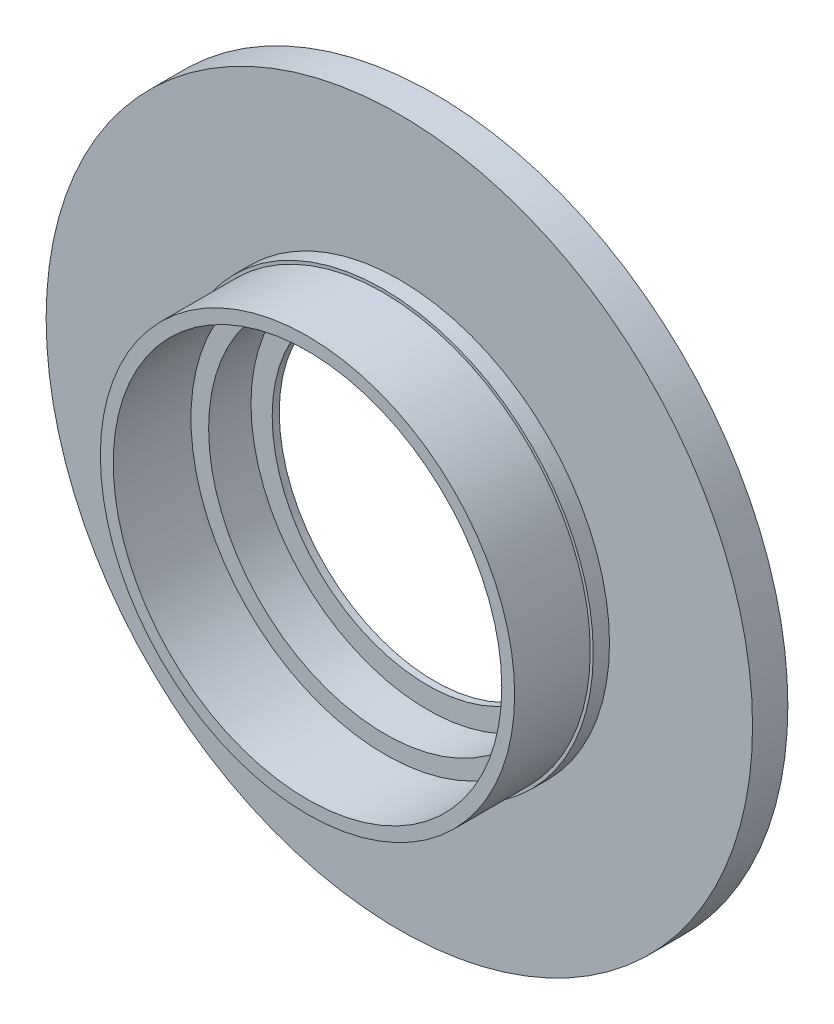
ISO-10303-21;
HEADER;
FILE_DESCRIPTION(('STEP AP214'),'2;1');
FILE_NAME('part.step','',(''),(''),'','','');
FILE_SCHEMA(('AUTOMOTIVE_DESIGN { 1 0 10303 214 1 1 1 1 }'));
ENDSEC;
DATA;
#1=APPLICATION_CONTEXT('core data for automotive mechanical design processes');
#2=APPLICATION_PROTOCOL_DEFINITION('international standard','automotive_design',2000,#1);
#3=PRODUCT_CONTEXT('',#1,'mechanical');
#4=PRODUCT('Part','Part','',(#3));
#5=PRODUCT_RELATED_PRODUCT_CATEGORY('part','',(#4));
#6=PRODUCT_DEFINITION_FORMATION('','',#4);
#7=PRODUCT_DEFINITION_CONTEXT('part definition',#1,'design');
#8=PRODUCT_DEFINITION('design','',#6,#7);
#9=PRODUCT_DEFINITION_SHAPE('','',#8);
#10=(LENGTH_UNIT() NAMED_UNIT(*) SI_UNIT(.MILLI.,.METRE.));
#11=(NAMED_UNIT(*) PLANE_ANGLE_UNIT() SI_UNIT($,.RADIAN.));
#12=(NAMED_UNIT(*) SI_UNIT($,.STERADIAN.) SOLID_ANGLE_UNIT());
#13=UNCERTAINTY_MEASURE_WITH_UNIT(LENGTH_MEASURE(1.E-05),#10,'distance_accuracy_value','');
#14=(GEOMETRIC_REPRESENTATION_CONTEXT(3) GLOBAL_UNCERTAINTY_ASSIGNED_CONTEXT((#13)) GLOBAL_UNIT_ASSIGNED_CONTEXT((#10,
#11,#12)) REPRESENTATION_CONTEXT('',''));
#15=CARTESIAN_POINT('',(0.,0.,0.));
#16=DIRECTION('',(0.,0.,1.));
#17=DIRECTION('',(1.,0.,0.));
#18=AXIS2_PLACEMENT_3D('',#15,#16,#17);
#19=CARTESIAN_POINT('',(0.,0.,5.));
#20=DIRECTION('',(0.,0.,-1.));
#21=DIRECTION('',(-1.,0.,0.));
#22=AXIS2_PLACEMENT_3D('',#19,#20,#21);
#23=CYLINDRICAL_SURFACE('',#22,22.);
#24=CARTESIAN_POINT('',(0.,0.,0.));
#25=DIRECTION('',(0.,0.,1.));
#26=DIRECTION('',(1.,0.,0.));
#27=AXIS2_PLACEMENT_3D('',#24,#25,#26);
#28=CIRCLE('',#27,22.);
#29=CARTESIAN_POINT('',(22.,0.,0.));
#30=VERTEX_POINT('',#29);
#31=EDGE_CURVE('E54',#30,#30,#28,.T.);
#32=ORIENTED_EDGE('',*,*,#31,.F.);
#33=EDGE_LOOP('',(#32));
#34=FACE_BOUND('',#33,.T.);
#35=CARTESIAN_POINT('',(0.,0.,1.));
#36=DIRECTION('',(0.,0.,1.));
#37=DIRECTION('',(1.,0.,0.));
#38=AXIS2_PLACEMENT_3D('',#35,#36,#37);
#39=CIRCLE('',#38,22.);
#40=CARTESIAN_POINT('',(22.,0.,1.));
#41=VERTEX_POINT('',#40);
#42=EDGE_CURVE('E97',#41,#41,#39,.T.);
#43=ORIENTED_EDGE('',*,*,#42,.T.);
#44=EDGE_LOOP('',(#43));
#45=FACE_BOUND('',#44,.T.);
#46=ADVANCED_FACE('F39',(#34,#45),#23,.F.);
#47=CARTESIAN_POINT('',(0.,0.,5.));
#48=DIRECTION('',(0.,0.,1.));
#49=DIRECTION('',(1.,0.,0.));
#50=AXIS2_PLACEMENT_3D('',#47,#48,#49);
#51=PLANE('',#50);
#52=CARTESIAN_POINT('',(0.,0.,5.));
#53=DIRECTION('',(0.,0.,1.));
#54=DIRECTION('',(1.,0.,0.));
#55=AXIS2_PLACEMENT_3D('',#52,#53,#54);
#56=CIRCLE('',#55,50.);
#57=CARTESIAN_POINT('',(50.,0.,5.));
#58=VERTEX_POINT('',#57);
#59=EDGE_CURVE('E47',#58,#58,#56,.T.);
#60=ORIENTED_EDGE('',*,*,#59,.T.);
#61=EDGE_LOOP('',(#60));
#62=FACE_BOUND('',#61,.T.);
#63=CARTESIAN_POINT('',(0.,0.,5.));
#64=DIRECTION('',(0.,0.,1.));
#65=DIRECTION('',(1.,0.,0.));
#66=AXIS2_PLACEMENT_3D('',#63,#64,#65);
#67=CIRCLE('',#66,29.75);
#68=CARTESIAN_POINT('',(29.75,0.,5.));
#69=VERTEX_POINT('',#68);
#70=EDGE_CURVE('E83',#69,#69,#67,.T.);
#71=ORIENTED_EDGE('',*,*,#70,.F.);
#72=EDGE_LOOP('',(#71));
#73=FACE_BOUND('',#72,.T.);
#74=ADVANCED_FACE('F120',(#62,#73),#51,.T.);
#75=CARTESIAN_POINT('',(0.,0.,5.));
#76=DIRECTION('',(0.,0.,-1.));
#77=DIRECTION('',(-1.,0.,0.));
#78=AXIS2_PLACEMENT_3D('',#75,#76,#77);
#79=CYLINDRICAL_SURFACE('',#78,50.);
#80=ORIENTED_EDGE('',*,*,#59,.F.);
#81=EDGE_LOOP('',(#80));
#82=FACE_BOUND('',#81,.T.);
#83=CARTESIAN_POINT('',(0.,0.,0.));
#84=DIRECTION('',(0.,0.,1.));
#85=DIRECTION('',(1.,0.,0.));
#86=AXIS2_PLACEMENT_3D('',#83,#84,#85);
#87=CIRCLE('',#86,50.);
#88=CARTESIAN_POINT('',(50.,0.,0.));
#89=VERTEX_POINT('',#88);
#90=EDGE_CURVE('E61',#89,#89,#87,.T.);
#91=ORIENTED_EDGE('',*,*,#90,.T.);
#92=EDGE_LOOP('',(#91));
#93=FACE_BOUND('',#92,.T.);
#94=ADVANCED_FACE('F41',(#82,#93),#79,.T.);
#95=CARTESIAN_POINT('',(0.,0.,0.));
#96=DIRECTION('',(0.,0.,1.));
#97=DIRECTION('',(1.,0.,0.));
#98=AXIS2_PLACEMENT_3D('',#95,#96,#97);
#99=PLANE('',#98);
#100=ORIENTED_EDGE('',*,*,#90,.F.);
#101=EDGE_LOOP('',(#100));
#102=FACE_BOUND('',#101,.T.);
#103=ORIENTED_EDGE('',*,*,#31,.T.);
#104=EDGE_LOOP('',(#103));
#105=FACE_BOUND('',#104,.T.);
#106=ADVANCED_FACE('F128',(#102,#105),#99,.F.);
#107=CARTESIAN_POINT('',(0.,0.,18.));
#108=DIRECTION('',(0.,0.,-1.));
#109=DIRECTION('',(-1.,0.,0.));
#110=AXIS2_PLACEMENT_3D('',#107,#108,#109);
#111=CYLINDRICAL_SURFACE('',#110,27.5);
#112=CARTESIAN_POINT('',(0.,0.,7.));
#113=DIRECTION('',(0.,0.,1.));
#114=DIRECTION('',(1.,0.,0.));
#115=AXIS2_PLACEMENT_3D('',#112,#113,#114);
#116=CIRCLE('',#115,27.5);
#117=CARTESIAN_POINT('',(27.5,0.,7.));
#118=VERTEX_POINT('',#117);
#119=EDGE_CURVE('E10',#118,#118,#116,.T.);
#120=ORIENTED_EDGE('',*,*,#119,.F.);
#121=EDGE_LOOP('',(#120));
#122=FACE_BOUND('',#121,.T.);
#123=CARTESIAN_POINT('',(0.,0.,18.));
#124=DIRECTION('',(0.,0.,1.));
#125=DIRECTION('',(1.,0.,0.));
#126=AXIS2_PLACEMENT_3D('',#123,#124,#125);
#127=CIRCLE('',#126,27.5);
#128=CARTESIAN_POINT('',(27.5,0.,18.));
#129=VERTEX_POINT('',#128);
#130=EDGE_CURVE('E73',#129,#129,#127,.T.);
#131=ORIENTED_EDGE('',*,*,#130,.T.);
#132=EDGE_LOOP('',(#131));
#133=FACE_BOUND('',#132,.T.);
#134=ADVANCED_FACE('F130',(#122,#133),#111,.F.);
#135=CARTESIAN_POINT('',(0.,0.,18.));
#136=DIRECTION('',(0.,0.,-1.));
#137=DIRECTION('',(-1.,0.,0.));
#138=AXIS2_PLACEMENT_3D('',#135,#136,#137);
#139=CYLINDRICAL_SURFACE('',#138,29.325);
#140=CARTESIAN_POINT('',(0.,0.,7.3));
#141=DIRECTION('',(0.,0.,1.));
#142=DIRECTION('',(1.,0.,0.));
#143=AXIS2_PLACEMENT_3D('',#140,#141,#142);
#144=CIRCLE('',#143,29.325);
#145=CARTESIAN_POINT('',(29.325,0.,7.3));
#146=VERTEX_POINT('',#145);
#147=EDGE_CURVE('E87',#146,#146,#144,.T.);
#148=ORIENTED_EDGE('',*,*,#147,.T.);
#149=EDGE_LOOP('',(#148));
#150=FACE_BOUND('',#149,.T.);
#151=CARTESIAN_POINT('',(0.,0.,18.));
#152=DIRECTION('',(0.,0.,1.));
#153=DIRECTION('',(1.,0.,0.));
#154=AXIS2_PLACEMENT_3D('',#151,#152,#153);
#155=CIRCLE('',#154,29.325);
#156=CARTESIAN_POINT('',(29.325,0.,18.));
#157=VERTEX_POINT('',#156);
#158=EDGE_CURVE('E64',#157,#157,#155,.T.);
#159=ORIENTED_EDGE('',*,*,#158,.F.);
#160=EDGE_LOOP('',(#159));
#161=FACE_BOUND('',#160,.T.);
#162=ADVANCED_FACE('F135',(#150,#161),#139,.T.);
#163=CARTESIAN_POINT('',(0.,0.,18.));
#164=DIRECTION('',(0.,0.,1.));
#165=DIRECTION('',(1.,0.,0.));
#166=AXIS2_PLACEMENT_3D('',#163,#164,#165);
#167=PLANE('',#166);
#168=ORIENTED_EDGE('',*,*,#130,.F.);
#169=EDGE_LOOP('',(#168));
#170=FACE_BOUND('',#169,.T.);
#171=ORIENTED_EDGE('',*,*,#158,.T.);
#172=EDGE_LOOP('',(#171));
#173=FACE_BOUND('',#172,.T.);
#174=ADVANCED_FACE('F139',(#170,#173),#167,.T.);
#175=CARTESIAN_POINT('',(0.,0.,7.3));
#176=DIRECTION('',(0.,0.,1.));
#177=DIRECTION('',(1.,0.,0.));
#178=AXIS2_PLACEMENT_3D('',#175,#176,#177);
#179=PLANE('',#178);
#180=CARTESIAN_POINT('',(0.,0.,7.3));
#181=DIRECTION('',(0.,0.,1.));
#182=DIRECTION('',(1.,0.,0.));
#183=AXIS2_PLACEMENT_3D('',#180,#181,#182);
#184=CIRCLE('',#183,29.75);
#185=CARTESIAN_POINT('',(29.75,0.,7.3));
#186=VERTEX_POINT('',#185);
#187=EDGE_CURVE('E79',#186,#186,#184,.T.);
#188=ORIENTED_EDGE('',*,*,#187,.T.);
#189=EDGE_LOOP('',(#188));
#190=FACE_BOUND('',#189,.T.);
#191=ORIENTED_EDGE('',*,*,#147,.F.);
#192=EDGE_LOOP('',(#191));
#193=FACE_BOUND('',#192,.T.);
#194=ADVANCED_FACE('F143',(#190,#193),#179,.T.);
#195=CARTESIAN_POINT('',(0.,0.,7.3));
#196=DIRECTION('',(0.,0.,-1.));
#197=DIRECTION('',(-1.,0.,0.));
#198=AXIS2_PLACEMENT_3D('',#195,#196,#197);
#199=CYLINDRICAL_SURFACE('',#198,29.75);
#200=ORIENTED_EDGE('',*,*,#187,.F.);
#201=EDGE_LOOP('',(#200));
#202=FACE_BOUND('',#201,.T.);
#203=ORIENTED_EDGE('',*,*,#70,.T.);
#204=EDGE_LOOP('',(#203));
#205=FACE_BOUND('',#204,.T.);
#206=ADVANCED_FACE('F117',(#202,#205),#199,.T.);
#207=CARTESIAN_POINT('',(0.,0.,7.));
#208=DIRECTION('',(0.,0.,1.));
#209=DIRECTION('',(1.,0.,0.));
#210=AXIS2_PLACEMENT_3D('',#207,#208,#209);
#211=PLANE('',#210);
#212=ORIENTED_EDGE('',*,*,#119,.T.);
#213=EDGE_LOOP('',(#212));
#214=FACE_BOUND('',#213,.T.);
#215=CARTESIAN_POINT('',(0.,0.,7.));
#216=DIRECTION('',(0.,0.,1.));
#217=DIRECTION('',(1.,0.,0.));
#218=AXIS2_PLACEMENT_3D('',#215,#216,#217);
#219=CIRCLE('',#218,25.);
#220=CARTESIAN_POINT('',(25.,0.,7.));
#221=VERTEX_POINT('',#220);
#222=EDGE_CURVE('E91',#221,#221,#219,.T.);
#223=ORIENTED_EDGE('',*,*,#222,.F.);
#224=EDGE_LOOP('',(#223));
#225=FACE_BOUND('',#224,.T.);
#226=ADVANCED_FACE('F111',(#214,#225),#211,.T.);
#227=CARTESIAN_POINT('',(0.,0.,7.));
#228=DIRECTION('',(0.,0.,-1.));
#229=DIRECTION('',(-1.,0.,0.));
#230=AXIS2_PLACEMENT_3D('',#227,#228,#229);
#231=CYLINDRICAL_SURFACE('',#230,25.);
#232=ORIENTED_EDGE('',*,*,#222,.T.);
#233=EDGE_LOOP('',(#232));
#234=FACE_BOUND('',#233,.T.);
#235=CARTESIAN_POINT('',(0.,0.,1.));
#236=DIRECTION('',(0.,0.,1.));
#237=DIRECTION('',(1.,0.,0.));
#238=AXIS2_PLACEMENT_3D('',#235,#236,#237);
#239=CIRCLE('',#238,25.);
#240=CARTESIAN_POINT('',(25.,0.,1.));
#241=VERTEX_POINT('',#240);
#242=EDGE_CURVE('E94',#241,#241,#239,.T.);
#243=ORIENTED_EDGE('',*,*,#242,.F.);
#244=EDGE_LOOP('',(#243));
#245=FACE_BOUND('',#244,.T.);
#246=ADVANCED_FACE('F106',(#234,#245),#231,.F.);
#247=CARTESIAN_POINT('',(0.,0.,1.));
#248=DIRECTION('',(0.,0.,1.));
#249=DIRECTION('',(1.,0.,0.));
#250=AXIS2_PLACEMENT_3D('',#247,#248,#249);
#251=PLANE('',#250);
#252=ORIENTED_EDGE('',*,*,#42,.F.);
#253=EDGE_LOOP('',(#252));
#254=FACE_BOUND('',#253,.T.);
#255=ORIENTED_EDGE('',*,*,#242,.T.);
#256=EDGE_LOOP('',(#255));
#257=FACE_BOUND('',#256,.T.);
#258=ADVANCED_FACE('F103',(#254,#257),#251,.T.);
#259=CLOSED_SHELL('',(#46,#74,#94,#106,#134,#162,#174,#194,#206,#226,#246,#258));
#260=MANIFOLD_SOLID_BREP('B2',#259);
#261=ADVANCED_BREP_SHAPE_REPRESENTATION('',(#18,#260),#14);
#262=SHAPE_DEFINITION_REPRESENTATION(#9,#261);
ENDSEC;
END-ISO-10303-21;
